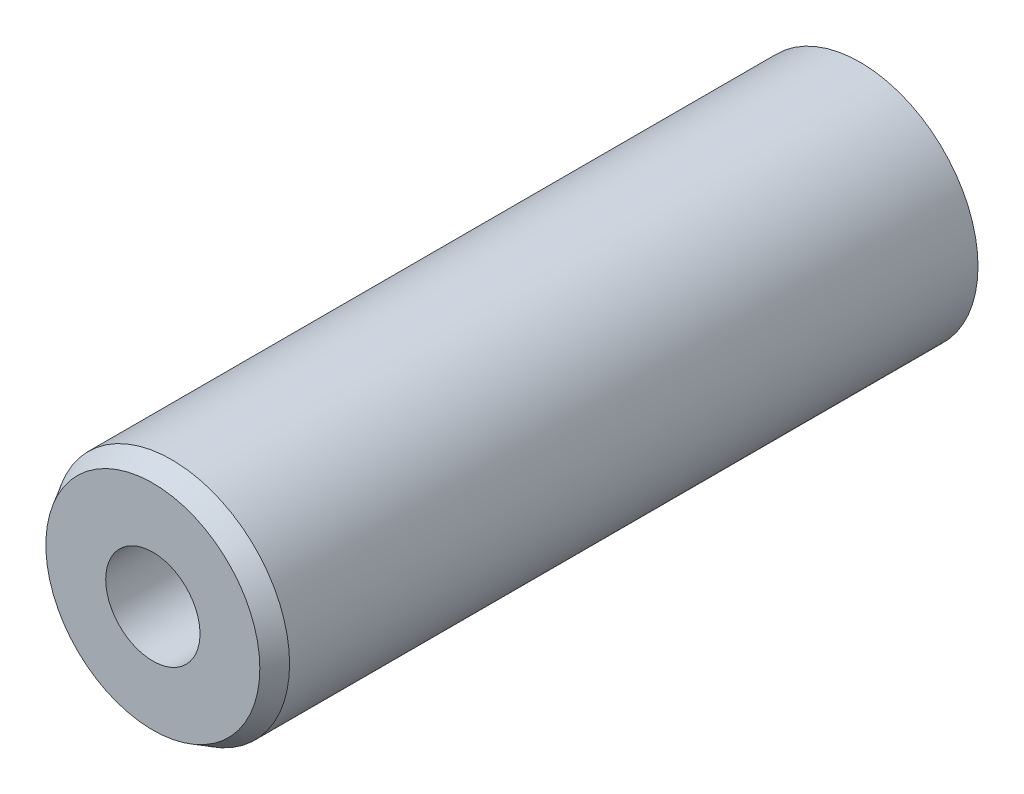
ISO-10303-21;
HEADER;
FILE_DESCRIPTION(('STEP AP214'),'2;1');
FILE_NAME('part.step','',(''),(''),'','','');
FILE_SCHEMA(('AUTOMOTIVE_DESIGN { 1 0 10303 214 1 1 1 1 }'));
ENDSEC;
DATA;
#1=APPLICATION_CONTEXT('core data for automotive mechanical design processes');
#2=APPLICATION_PROTOCOL_DEFINITION('international standard','automotive_design',2000,#1);
#3=PRODUCT_CONTEXT('',#1,'mechanical');
#4=PRODUCT('Part','Part','',(#3));
#5=PRODUCT_RELATED_PRODUCT_CATEGORY('part','',(#4));
#6=PRODUCT_DEFINITION_FORMATION('','',#4);
#7=PRODUCT_DEFINITION_CONTEXT('part definition',#1,'design');
#8=PRODUCT_DEFINITION('design','',#6,#7);
#9=PRODUCT_DEFINITION_SHAPE('','',#8);
#10=(LENGTH_UNIT() NAMED_UNIT(*) SI_UNIT(.MILLI.,.METRE.));
#11=(NAMED_UNIT(*) PLANE_ANGLE_UNIT() SI_UNIT($,.RADIAN.));
#12=(NAMED_UNIT(*) SI_UNIT($,.STERADIAN.) SOLID_ANGLE_UNIT());
#13=UNCERTAINTY_MEASURE_WITH_UNIT(LENGTH_MEASURE(1.E-05),#10,'distance_accuracy_value','');
#14=(GEOMETRIC_REPRESENTATION_CONTEXT(3) GLOBAL_UNCERTAINTY_ASSIGNED_CONTEXT((#13)) GLOBAL_UNIT_ASSIGNED_CONTEXT((#10,
#11,#12)) REPRESENTATION_CONTEXT('',''));
#15=CARTESIAN_POINT('',(0.,0.,0.));
#16=DIRECTION('',(0.,0.,1.));
#17=DIRECTION('',(1.,0.,0.));
#18=AXIS2_PLACEMENT_3D('',#15,#16,#17);
#19=CARTESIAN_POINT('',(0.,0.,15.));
#20=DIRECTION('',(0.,0.,-1.));
#21=DIRECTION('',(-1.,0.,0.));
#22=AXIS2_PLACEMENT_3D('',#19,#20,#21);
#23=CYLINDRICAL_SURFACE('',#22,2.5);
#24=CARTESIAN_POINT('',(0.,0.,14.6));
#25=DIRECTION('',(0.,0.,1.));
#26=DIRECTION('',(1.,0.,0.));
#27=AXIS2_PLACEMENT_3D('',#24,#25,#26);
#28=CIRCLE('',#27,2.5);
#29=CARTESIAN_POINT('',(2.5,0.,14.6));
#30=VERTEX_POINT('',#29);
#31=EDGE_CURVE('E48',#30,#30,#28,.F.);
#32=ORIENTED_EDGE('',*,*,#31,.T.);
#33=EDGE_LOOP('',(#32));
#34=FACE_BOUND('',#33,.T.);
#35=CARTESIAN_POINT('',(0.,0.,0.));
#36=DIRECTION('',(0.,0.,1.));
#37=DIRECTION('',(1.,0.,0.));
#38=AXIS2_PLACEMENT_3D('',#35,#36,#37);
#39=CIRCLE('',#38,2.5);
#40=CARTESIAN_POINT('',(2.5,0.,0.));
#41=VERTEX_POINT('',#40);
#42=EDGE_CURVE('E57',#41,#41,#39,.T.);
#43=ORIENTED_EDGE('',*,*,#42,.T.);
#44=EDGE_LOOP('',(#43));
#45=FACE_BOUND('',#44,.T.);
#46=ADVANCED_FACE('F37',(#34,#45),#23,.T.);
#47=CARTESIAN_POINT('',(0.,0.,15.));
#48=DIRECTION('',(0.,0.,1.));
#49=DIRECTION('',(1.,0.,0.));
#50=AXIS2_PLACEMENT_3D('',#47,#48,#49);
#51=PLANE('',#50);
#52=CARTESIAN_POINT('',(0.,0.,15.));
#53=DIRECTION('',(0.,0.,1.));
#54=DIRECTION('',(1.,0.,0.));
#55=AXIS2_PLACEMENT_3D('',#52,#53,#54);
#56=CIRCLE('',#55,2.26905989232415);
#57=CARTESIAN_POINT('',(2.26905989232415,0.,15.));
#58=VERTEX_POINT('',#57);
#59=EDGE_CURVE('E52',#58,#58,#56,.T.);
#60=ORIENTED_EDGE('',*,*,#59,.T.);
#61=EDGE_LOOP('',(#60));
#62=FACE_BOUND('',#61,.T.);
#63=CARTESIAN_POINT('',(0.,0.,15.));
#64=DIRECTION('',(0.,0.,-1.));
#65=DIRECTION('',(-1.,0.,0.));
#66=AXIS2_PLACEMENT_3D('',#63,#64,#65);
#67=CIRCLE('',#66,1.);
#68=CARTESIAN_POINT('',(-1.,0.,15.));
#69=VERTEX_POINT('',#68);
#70=EDGE_CURVE('E61',#69,#69,#67,.T.);
#71=ORIENTED_EDGE('',*,*,#70,.T.);
#72=EDGE_LOOP('',(#71));
#73=FACE_BOUND('',#72,.T.);
#74=ADVANCED_FACE('F85',(#62,#73),#51,.T.);
#75=CARTESIAN_POINT('',(0.,0.,0.));
#76=DIRECTION('',(0.,0.,1.));
#77=DIRECTION('',(1.,0.,0.));
#78=AXIS2_PLACEMENT_3D('',#75,#76,#77);
#79=PLANE('',#78);
#80=CARTESIAN_POINT('',(0.,0.,0.));
#81=DIRECTION('',(0.,0.,1.));
#82=DIRECTION('',(1.,0.,0.));
#83=AXIS2_PLACEMENT_3D('',#80,#81,#82);
#84=CIRCLE('',#83,2.15);
#85=CARTESIAN_POINT('',(2.15,0.,0.));
#86=VERTEX_POINT('',#85);
#87=EDGE_CURVE('E10',#86,#86,#84,.T.);
#88=ORIENTED_EDGE('',*,*,#87,.T.);
#89=EDGE_LOOP('',(#88));
#90=FACE_BOUND('',#89,.T.);
#91=ORIENTED_EDGE('',*,*,#42,.F.);
#92=EDGE_LOOP('',(#91));
#93=FACE_BOUND('',#92,.T.);
#94=ADVANCED_FACE('F91',(#90,#93),#79,.F.);
#95=CARTESIAN_POINT('',(0.,0.,15.));
#96=DIRECTION('',(0.,0.,-1.));
#97=DIRECTION('',(-1.,0.,0.));
#98=AXIS2_PLACEMENT_3D('',#95,#96,#97);
#99=CYLINDRICAL_SURFACE('',#98,1.);
#100=CARTESIAN_POINT('',(0.,0.,11.3905594023679));
#101=DIRECTION('',(0.,0.,-1.));
#102=DIRECTION('',(-1.,0.,0.));
#103=AXIS2_PLACEMENT_3D('',#100,#101,#102);
#104=CIRCLE('',#103,1.);
#105=CARTESIAN_POINT('',(-1.,0.,11.3905594023679));
#106=VERTEX_POINT('',#105);
#107=EDGE_CURVE('E58',#106,#106,#104,.T.);
#108=ORIENTED_EDGE('',*,*,#107,.T.);
#109=EDGE_LOOP('',(#108));
#110=FACE_BOUND('',#109,.T.);
#111=ORIENTED_EDGE('',*,*,#70,.F.);
#112=EDGE_LOOP('',(#111));
#113=FACE_BOUND('',#112,.T.);
#114=ADVANCED_FACE('F82',(#110,#113),#99,.F.);
#115=CARTESIAN_POINT('',(0.,0.,11.));
#116=DIRECTION('',(0.,0.,-1.));
#117=DIRECTION('',(-1.,0.,0.));
#118=AXIS2_PLACEMENT_3D('',#115,#116,#117);
#119=CONICAL_SURFACE('',#118,1.65,1.02974425867665);
#120=CARTESIAN_POINT('',(0.,0.,11.));
#121=DIRECTION('',(0.,0.,-1.));
#122=DIRECTION('',(-1.,0.,0.));
#123=AXIS2_PLACEMENT_3D('',#120,#121,#122);
#124=CIRCLE('',#123,1.65);
#125=CARTESIAN_POINT('',(-1.65,0.,11.));
#126=VERTEX_POINT('',#125);
#127=EDGE_CURVE('E62',#126,#126,#124,.T.);
#128=ORIENTED_EDGE('',*,*,#127,.T.);
#129=EDGE_LOOP('',(#128));
#130=FACE_BOUND('',#129,.T.);
#131=ORIENTED_EDGE('',*,*,#107,.F.);
#132=EDGE_LOOP('',(#131));
#133=FACE_BOUND('',#132,.T.);
#134=ADVANCED_FACE('F70',(#130,#133),#119,.F.);
#135=CARTESIAN_POINT('',(0.,0.,0.));
#136=DIRECTION('',(0.,0.,-1.));
#137=DIRECTION('',(-1.,0.,0.));
#138=AXIS2_PLACEMENT_3D('',#135,#136,#137);
#139=CYLINDRICAL_SURFACE('',#138,1.65);
#140=CARTESIAN_POINT('',(0.,0.,0.866025403784435));
#141=DIRECTION('',(0.,0.,1.));
#142=DIRECTION('',(1.,0.,0.));
#143=AXIS2_PLACEMENT_3D('',#140,#141,#142);
#144=CIRCLE('',#143,1.65);
#145=CARTESIAN_POINT('',(1.65,0.,0.866025403784435));
#146=VERTEX_POINT('',#145);
#147=EDGE_CURVE('E44',#146,#146,#144,.F.);
#148=ORIENTED_EDGE('',*,*,#147,.T.);
#149=EDGE_LOOP('',(#148));
#150=FACE_BOUND('',#149,.T.);
#151=ORIENTED_EDGE('',*,*,#127,.F.);
#152=EDGE_LOOP('',(#151));
#153=FACE_BOUND('',#152,.T.);
#154=ADVANCED_FACE('F73',(#150,#153),#139,.F.);
#155=CARTESIAN_POINT('',(0.,0.,15.));
#156=DIRECTION('',(0.,0.,-1.));
#157=DIRECTION('',(-1.,0.,0.));
#158=AXIS2_PLACEMENT_3D('',#155,#156,#157);
#159=CONICAL_SURFACE('',#158,2.26905989232415,0.523598775598298);
#160=ORIENTED_EDGE('',*,*,#31,.F.);
#161=EDGE_LOOP('',(#160));
#162=FACE_BOUND('',#161,.T.);
#163=ORIENTED_EDGE('',*,*,#59,.F.);
#164=EDGE_LOOP('',(#163));
#165=FACE_BOUND('',#164,.T.);
#166=ADVANCED_FACE('F75',(#162,#165),#159,.T.);
#167=CARTESIAN_POINT('',(0.,0.,0.866025403784435));
#168=DIRECTION('',(0.,0.,-1.));
#169=DIRECTION('',(-1.,0.,0.));
#170=AXIS2_PLACEMENT_3D('',#167,#168,#169);
#171=CONICAL_SURFACE('',#170,1.65,0.5235987755983);
#172=ORIENTED_EDGE('',*,*,#87,.F.);
#173=EDGE_LOOP('',(#172));
#174=FACE_BOUND('',#173,.T.);
#175=ORIENTED_EDGE('',*,*,#147,.F.);
#176=EDGE_LOOP('',(#175));
#177=FACE_BOUND('',#176,.T.);
#178=ADVANCED_FACE('F39',(#174,#177),#171,.F.);
#179=CLOSED_SHELL('',(#46,#74,#94,#114,#134,#154,#166,#178));
#180=MANIFOLD_SOLID_BREP('B2',#179);
#181=ADVANCED_BREP_SHAPE_REPRESENTATION('',(#18,#180),#14);
#182=SHAPE_DEFINITION_REPRESENTATION(#9,#181);
ENDSEC;
END-ISO-10303-21;
